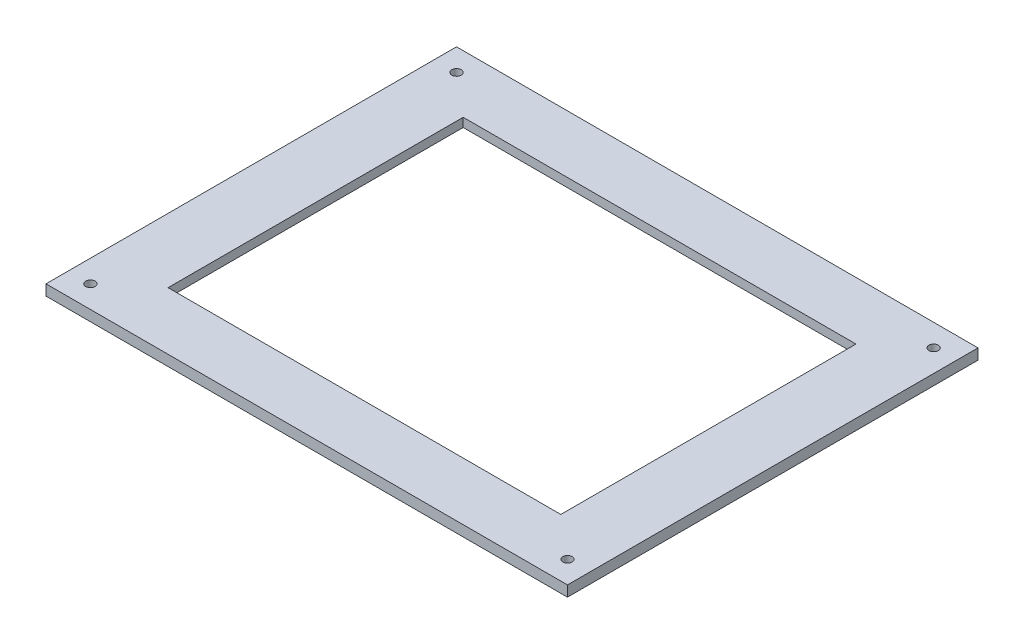
ISO-10303-21;
HEADER;
FILE_DESCRIPTION(('STEP AP214'),'2;1');
FILE_NAME('part.step','',(''),(''),'','','');
FILE_SCHEMA(('AUTOMOTIVE_DESIGN { 1 0 10303 214 1 1 1 1 }'));
ENDSEC;
DATA;
#1=APPLICATION_CONTEXT('core data for automotive mechanical design processes');
#2=APPLICATION_PROTOCOL_DEFINITION('international standard','automotive_design',2000,#1);
#3=PRODUCT_CONTEXT('',#1,'mechanical');
#4=PRODUCT('Part','Part','',(#3));
#5=PRODUCT_RELATED_PRODUCT_CATEGORY('part','',(#4));
#6=PRODUCT_DEFINITION_FORMATION('','',#4);
#7=PRODUCT_DEFINITION_CONTEXT('part definition',#1,'design');
#8=PRODUCT_DEFINITION('design','',#6,#7);
#9=PRODUCT_DEFINITION_SHAPE('','',#8);
#10=(LENGTH_UNIT() NAMED_UNIT(*) SI_UNIT(.MILLI.,.METRE.));
#11=(NAMED_UNIT(*) PLANE_ANGLE_UNIT() SI_UNIT($,.RADIAN.));
#12=(NAMED_UNIT(*) SI_UNIT($,.STERADIAN.) SOLID_ANGLE_UNIT());
#13=UNCERTAINTY_MEASURE_WITH_UNIT(LENGTH_MEASURE(1.E-05),#10,'distance_accuracy_value','');
#14=(GEOMETRIC_REPRESENTATION_CONTEXT(3) GLOBAL_UNCERTAINTY_ASSIGNED_CONTEXT((#13)) GLOBAL_UNIT_ASSIGNED_CONTEXT((#10,
#11,#12)) REPRESENTATION_CONTEXT('',''));
#15=CARTESIAN_POINT('',(0.,0.,0.));
#16=DIRECTION('',(0.,0.,1.));
#17=DIRECTION('',(1.,0.,0.));
#18=AXIS2_PLACEMENT_3D('',#15,#16,#17);
#19=CARTESIAN_POINT('',(0.,-0.8,0.));
#20=DIRECTION('',(0.,-1.,0.));
#21=DIRECTION('',(0.,0.,-1.));
#22=AXIS2_PLACEMENT_3D('',#19,#20,#21);
#23=PLANE('',#22);
#24=DIRECTION('',(-1.,0.,0.));
#25=VECTOR('',#24,1.);
#26=CARTESIAN_POINT('',(0.,-0.8,11.0000000000002));
#27=LINE('',#26,#25);
#28=CARTESIAN_POINT('',(-94.,-0.8,11.));
#29=VERTEX_POINT('',#28);
#30=CARTESIAN_POINT('',(-106.,-0.8,11.));
#31=VERTEX_POINT('',#30);
#32=EDGE_CURVE('E218',#29,#31,#27,.T.);
#33=ORIENTED_EDGE('',*,*,#32,.F.);
#34=DIRECTION('',(0.,0.,-1.));
#35=VECTOR('',#34,1.);
#36=CARTESIAN_POINT('',(-94.,-0.8,-71.));
#37=LINE('',#36,#35);
#38=CARTESIAN_POINT('',(-94.,-0.8,71.));
#39=VERTEX_POINT('',#38);
#40=EDGE_CURVE('E295',#39,#29,#37,.T.);
#41=ORIENTED_EDGE('',*,*,#40,.F.);
#42=DIRECTION('',(-1.,0.,0.));
#43=VECTOR('',#42,1.);
#44=CARTESIAN_POINT('',(94.,-0.8,71.));
#45=LINE('',#44,#43);
#46=CARTESIAN_POINT('',(94.,-0.8,71.));
#47=VERTEX_POINT('',#46);
#48=EDGE_CURVE('E308',#47,#39,#45,.T.);
#49=ORIENTED_EDGE('',*,*,#48,.F.);
#50=DIRECTION('',(0.,0.,1.));
#51=VECTOR('',#50,1.);
#52=CARTESIAN_POINT('',(94.,-0.8,-71.));
#53=LINE('',#52,#51);
#54=CARTESIAN_POINT('',(94.,-0.8,11.));
#55=VERTEX_POINT('',#54);
#56=EDGE_CURVE('E303',#55,#47,#53,.T.);
#57=ORIENTED_EDGE('',*,*,#56,.F.);
#58=DIRECTION('',(1.,0.,0.));
#59=VECTOR('',#58,1.);
#60=CARTESIAN_POINT('',(0.,-0.8,11.));
#61=LINE('',#60,#59);
#62=CARTESIAN_POINT('',(106.,-0.8,11.));
#63=VERTEX_POINT('',#62);
#64=EDGE_CURVE('E248',#55,#63,#61,.T.);
#65=ORIENTED_EDGE('',*,*,#64,.T.);
#66=DIRECTION('',(0.,0.,-1.));
#67=VECTOR('',#66,1.);
#68=CARTESIAN_POINT('',(106.,-0.8,0.));
#69=LINE('',#68,#67);
#70=CARTESIAN_POINT('',(106.,-0.8,-11.));
#71=VERTEX_POINT('',#70);
#72=EDGE_CURVE('E261',#63,#71,#69,.T.);
#73=ORIENTED_EDGE('',*,*,#72,.T.);
#74=DIRECTION('',(-1.,0.,0.));
#75=VECTOR('',#74,1.);
#76=CARTESIAN_POINT('',(0.,-0.8,-11.));
#77=LINE('',#76,#75);
#78=CARTESIAN_POINT('',(94.,-0.8,-11.));
#79=VERTEX_POINT('',#78);
#80=EDGE_CURVE('E257',#71,#79,#77,.T.);
#81=ORIENTED_EDGE('',*,*,#80,.T.);
#82=CARTESIAN_POINT('',(94.,-0.8,-71.));
#83=VERTEX_POINT('',#82);
#84=EDGE_CURVE('E304',#83,#79,#53,.T.);
#85=ORIENTED_EDGE('',*,*,#84,.F.);
#86=DIRECTION('',(1.,0.,0.));
#87=VECTOR('',#86,1.);
#88=CARTESIAN_POINT('',(94.,-0.8,-71.));
#89=LINE('',#88,#87);
#90=CARTESIAN_POINT('',(-94.,-0.8,-71.));
#91=VERTEX_POINT('',#90);
#92=EDGE_CURVE('E299',#91,#83,#89,.T.);
#93=ORIENTED_EDGE('',*,*,#92,.F.);
#94=CARTESIAN_POINT('',(-94.,-0.8,-11.));
#95=VERTEX_POINT('',#94);
#96=EDGE_CURVE('E300',#95,#91,#37,.T.);
#97=ORIENTED_EDGE('',*,*,#96,.F.);
#98=DIRECTION('',(1.,0.,0.));
#99=VECTOR('',#98,1.);
#100=CARTESIAN_POINT('',(0.,-0.8,-11.));
#101=LINE('',#100,#99);
#102=CARTESIAN_POINT('',(-106.,-0.8,-11.));
#103=VERTEX_POINT('',#102);
#104=EDGE_CURVE('E60',#103,#95,#101,.T.);
#105=ORIENTED_EDGE('',*,*,#104,.F.);
#106=DIRECTION('',(0.,0.,-1.));
#107=VECTOR('',#106,1.);
#108=CARTESIAN_POINT('',(-106.,-0.8,0.));
#109=LINE('',#108,#107);
#110=EDGE_CURVE('E200',#31,#103,#109,.T.);
#111=ORIENTED_EDGE('',*,*,#110,.F.);
#112=EDGE_LOOP('',(#33,#41,#49,#57,#65,#73,#81,#85,#93,#97,#105,#111));
#113=FACE_BOUND('',#112,.T.);
#114=CARTESIAN_POINT('',(107.5,-0.8,-82.5));
#115=DIRECTION('',(0.,-1.,0.));
#116=DIRECTION('',(0.,0.,-1.));
#117=AXIS2_PLACEMENT_3D('',#114,#115,#116);
#118=CIRCLE('',#117,2.125);
#119=CARTESIAN_POINT('',(107.5,-0.8,-84.625));
#120=VERTEX_POINT('',#119);
#121=EDGE_CURVE('E437',#120,#120,#118,.F.);
#122=ORIENTED_EDGE('',*,*,#121,.T.);
#123=EDGE_LOOP('',(#122));
#124=FACE_BOUND('',#123,.T.);
#125=CARTESIAN_POINT('',(107.5,-0.8,82.5));
#126=DIRECTION('',(0.,-1.,0.));
#127=DIRECTION('',(0.,0.,-1.));
#128=AXIS2_PLACEMENT_3D('',#125,#126,#127);
#129=CIRCLE('',#128,2.125);
#130=CARTESIAN_POINT('',(107.5,-0.8,80.375));
#131=VERTEX_POINT('',#130);
#132=EDGE_CURVE('E433',#131,#131,#129,.T.);
#133=ORIENTED_EDGE('',*,*,#132,.F.);
#134=EDGE_LOOP('',(#133));
#135=FACE_BOUND('',#134,.T.);
#136=CARTESIAN_POINT('',(-107.5,-0.8,-82.5));
#137=DIRECTION('',(0.,-1.,0.));
#138=DIRECTION('',(0.,0.,-1.));
#139=AXIS2_PLACEMENT_3D('',#136,#137,#138);
#140=CIRCLE('',#139,2.125);
#141=CARTESIAN_POINT('',(-107.5,-0.8,-84.625));
#142=VERTEX_POINT('',#141);
#143=EDGE_CURVE('E294',#142,#142,#140,.T.);
#144=ORIENTED_EDGE('',*,*,#143,.F.);
#145=EDGE_LOOP('',(#144));
#146=FACE_BOUND('',#145,.T.);
#147=DIRECTION('',(-1.,0.,0.));
#148=VECTOR('',#147,1.);
#149=CARTESIAN_POINT('',(117.5,-0.8,92.5));
#150=LINE('',#149,#148);
#151=CARTESIAN_POINT('',(117.5,-0.8,92.5));
#152=VERTEX_POINT('',#151);
#153=CARTESIAN_POINT('',(-117.5,-0.8,92.5));
#154=VERTEX_POINT('',#153);
#155=EDGE_CURVE('E345',#152,#154,#150,.T.);
#156=ORIENTED_EDGE('',*,*,#155,.T.);
#157=DIRECTION('',(0.,0.,-1.));
#158=VECTOR('',#157,1.);
#159=CARTESIAN_POINT('',(-117.5,-0.8,92.5));
#160=LINE('',#159,#158);
#161=CARTESIAN_POINT('',(-117.5,-0.8,-92.5));
#162=VERTEX_POINT('',#161);
#163=EDGE_CURVE('E349',#154,#162,#160,.T.);
#164=ORIENTED_EDGE('',*,*,#163,.T.);
#165=DIRECTION('',(1.,0.,0.));
#166=VECTOR('',#165,1.);
#167=CARTESIAN_POINT('',(-117.5,-0.8,-92.5));
#168=LINE('',#167,#166);
#169=CARTESIAN_POINT('',(117.5,-0.8,-92.5));
#170=VERTEX_POINT('',#169);
#171=EDGE_CURVE('E353',#162,#170,#168,.T.);
#172=ORIENTED_EDGE('',*,*,#171,.T.);
#173=DIRECTION('',(0.,0.,1.));
#174=VECTOR('',#173,1.);
#175=CARTESIAN_POINT('',(117.5,-0.8,-92.5));
#176=LINE('',#175,#174);
#177=EDGE_CURVE('E357',#170,#152,#176,.T.);
#178=ORIENTED_EDGE('',*,*,#177,.T.);
#179=EDGE_LOOP('',(#156,#164,#172,#178));
#180=FACE_BOUND('',#179,.T.);
#181=CARTESIAN_POINT('',(-107.5,-0.8,82.5));
#182=DIRECTION('',(0.,-1.,0.));
#183=DIRECTION('',(0.,0.,-1.));
#184=AXIS2_PLACEMENT_3D('',#181,#182,#183);
#185=CIRCLE('',#184,2.125);
#186=CARTESIAN_POINT('',(-107.5,-0.8,80.375));
#187=VERTEX_POINT('',#186);
#188=EDGE_CURVE('E441',#187,#187,#185,.F.);
#189=ORIENTED_EDGE('',*,*,#188,.T.);
#190=EDGE_LOOP('',(#189));
#191=FACE_BOUND('',#190,.T.);
#192=ADVANCED_FACE('F44',(#113,#124,#135,#146,#180,#191),#23,.T.);
#193=CARTESIAN_POINT('',(-94.,-0.8,-71.));
#194=DIRECTION('',(1.,0.,0.));
#195=DIRECTION('',(0.,0.,-1.));
#196=AXIS2_PLACEMENT_3D('',#193,#194,#195);
#197=PLANE('',#196);
#198=DIRECTION('',(0.,-1.,0.));
#199=VECTOR('',#198,1.);
#200=CARTESIAN_POINT('',(-94.,-0.8,11.));
#201=LINE('',#200,#199);
#202=CARTESIAN_POINT('',(-94.,0.,11.));
#203=VERTEX_POINT('',#202);
#204=EDGE_CURVE('E11',#203,#29,#201,.T.);
#205=ORIENTED_EDGE('',*,*,#204,.F.);
#206=DIRECTION('',(0.,0.,-1.));
#207=VECTOR('',#206,1.);
#208=CARTESIAN_POINT('',(-94.,0.,-71.));
#209=LINE('',#208,#207);
#210=CARTESIAN_POINT('',(-94.,0.,71.));
#211=VERTEX_POINT('',#210);
#212=EDGE_CURVE('E312',#211,#203,#209,.T.);
#213=ORIENTED_EDGE('',*,*,#212,.F.);
#214=DIRECTION('',(0.,1.,0.));
#215=VECTOR('',#214,1.);
#216=CARTESIAN_POINT('',(-94.,-0.8,71.));
#217=LINE('',#216,#215);
#218=EDGE_CURVE('E311',#39,#211,#217,.T.);
#219=ORIENTED_EDGE('',*,*,#218,.F.);
#220=ORIENTED_EDGE('',*,*,#40,.T.);
#221=EDGE_LOOP('',(#205,#213,#219,#220));
#222=FACE_BOUND('',#221,.T.);
#223=ADVANCED_FACE('F488',(#222),#197,.T.);
#224=CARTESIAN_POINT('',(94.,-0.8,-71.));
#225=DIRECTION('',(-1.,0.,0.));
#226=DIRECTION('',(0.,0.,1.));
#227=AXIS2_PLACEMENT_3D('',#224,#225,#226);
#228=PLANE('',#227);
#229=DIRECTION('',(0.,0.,1.));
#230=VECTOR('',#229,1.);
#231=CARTESIAN_POINT('',(94.,0.,-71.));
#232=LINE('',#231,#230);
#233=CARTESIAN_POINT('',(94.,0.,11.));
#234=VERTEX_POINT('',#233);
#235=CARTESIAN_POINT('',(94.,0.,71.));
#236=VERTEX_POINT('',#235);
#237=EDGE_CURVE('E322',#234,#236,#232,.T.);
#238=ORIENTED_EDGE('',*,*,#237,.F.);
#239=DIRECTION('',(0.,-1.,0.));
#240=VECTOR('',#239,1.);
#241=CARTESIAN_POINT('',(94.,-0.8,11.));
#242=LINE('',#241,#240);
#243=EDGE_CURVE('E448',#234,#55,#242,.T.);
#244=ORIENTED_EDGE('',*,*,#243,.T.);
#245=ORIENTED_EDGE('',*,*,#56,.T.);
#246=DIRECTION('',(0.,1.,0.));
#247=VECTOR('',#246,1.);
#248=CARTESIAN_POINT('',(94.,-0.8,71.));
#249=LINE('',#248,#247);
#250=EDGE_CURVE('E334',#47,#236,#249,.T.);
#251=ORIENTED_EDGE('',*,*,#250,.T.);
#252=EDGE_LOOP('',(#238,#244,#245,#251));
#253=FACE_BOUND('',#252,.T.);
#254=ADVANCED_FACE('F476',(#253),#228,.T.);
#255=ORIENTED_EDGE('',*,*,#84,.T.);
#256=DIRECTION('',(0.,1.,0.));
#257=VECTOR('',#256,1.);
#258=CARTESIAN_POINT('',(94.,-0.8,-11.));
#259=LINE('',#258,#257);
#260=CARTESIAN_POINT('',(94.,0.,-11.));
#261=VERTEX_POINT('',#260);
#262=EDGE_CURVE('E429',#79,#261,#259,.T.);
#263=ORIENTED_EDGE('',*,*,#262,.T.);
#264=CARTESIAN_POINT('',(94.,0.,-71.));
#265=VERTEX_POINT('',#264);
#266=EDGE_CURVE('E323',#265,#261,#232,.T.);
#267=ORIENTED_EDGE('',*,*,#266,.F.);
#268=DIRECTION('',(0.,1.,0.));
#269=VECTOR('',#268,1.);
#270=CARTESIAN_POINT('',(94.,-0.8,-71.));
#271=LINE('',#270,#269);
#272=EDGE_CURVE('E338',#83,#265,#271,.T.);
#273=ORIENTED_EDGE('',*,*,#272,.F.);
#274=EDGE_LOOP('',(#255,#263,#267,#273));
#275=FACE_BOUND('',#274,.T.);
#276=ADVANCED_FACE('F494',(#275),#228,.T.);
#277=CARTESIAN_POINT('',(0.,4.,0.));
#278=DIRECTION('',(0.,1.,0.));
#279=DIRECTION('',(0.,0.,1.));
#280=AXIS2_PLACEMENT_3D('',#277,#278,#279);
#281=PLANE('',#280);
#282=CARTESIAN_POINT('',(107.5,4.,-82.5));
#283=DIRECTION('',(0.,1.,0.));
#284=DIRECTION('',(0.,0.,1.));
#285=AXIS2_PLACEMENT_3D('',#282,#283,#284);
#286=CIRCLE('',#285,2.125);
#287=CARTESIAN_POINT('',(107.5,4.,-80.375));
#288=VERTEX_POINT('',#287);
#289=EDGE_CURVE('E282',#288,#288,#286,.F.);
#290=ORIENTED_EDGE('',*,*,#289,.T.);
#291=EDGE_LOOP('',(#290));
#292=FACE_BOUND('',#291,.T.);
#293=CARTESIAN_POINT('',(107.5,4.,82.5));
#294=DIRECTION('',(0.,1.,0.));
#295=DIRECTION('',(0.,0.,1.));
#296=AXIS2_PLACEMENT_3D('',#293,#294,#295);
#297=CIRCLE('',#296,2.125);
#298=CARTESIAN_POINT('',(107.5,4.,84.625));
#299=VERTEX_POINT('',#298);
#300=EDGE_CURVE('E236',#299,#299,#297,.T.);
#301=ORIENTED_EDGE('',*,*,#300,.F.);
#302=EDGE_LOOP('',(#301));
#303=FACE_BOUND('',#302,.T.);
#304=CARTESIAN_POINT('',(-107.5,4.,-82.5));
#305=DIRECTION('',(0.,1.,0.));
#306=DIRECTION('',(0.,0.,1.));
#307=AXIS2_PLACEMENT_3D('',#304,#305,#306);
#308=CIRCLE('',#307,2.125);
#309=CARTESIAN_POINT('',(-107.5,4.,-80.375));
#310=VERTEX_POINT('',#309);
#311=EDGE_CURVE('E287',#310,#310,#308,.T.);
#312=ORIENTED_EDGE('',*,*,#311,.F.);
#313=EDGE_LOOP('',(#312));
#314=FACE_BOUND('',#313,.T.);
#315=DIRECTION('',(0.,0.,1.));
#316=VECTOR('',#315,1.);
#317=CARTESIAN_POINT('',(-117.5,4.,92.5));
#318=LINE('',#317,#316);
#319=CARTESIAN_POINT('',(-117.5,4.,-92.5));
#320=VERTEX_POINT('',#319);
#321=CARTESIAN_POINT('',(-117.5,4.,92.5));
#322=VERTEX_POINT('',#321);
#323=EDGE_CURVE('E404',#320,#322,#318,.T.);
#324=ORIENTED_EDGE('',*,*,#323,.T.);
#325=DIRECTION('',(1.,0.,0.));
#326=VECTOR('',#325,1.);
#327=CARTESIAN_POINT('',(117.5,4.,92.5));
#328=LINE('',#327,#326);
#329=CARTESIAN_POINT('',(117.5,4.,92.5));
#330=VERTEX_POINT('',#329);
#331=EDGE_CURVE('E408',#322,#330,#328,.T.);
#332=ORIENTED_EDGE('',*,*,#331,.T.);
#333=DIRECTION('',(0.,0.,-1.));
#334=VECTOR('',#333,1.);
#335=CARTESIAN_POINT('',(117.5,4.,92.5));
#336=LINE('',#335,#334);
#337=CARTESIAN_POINT('',(117.5,4.,-92.5));
#338=VERTEX_POINT('',#337);
#339=EDGE_CURVE('E411',#330,#338,#336,.T.);
#340=ORIENTED_EDGE('',*,*,#339,.T.);
#341=DIRECTION('',(-1.,0.,0.));
#342=VECTOR('',#341,1.);
#343=CARTESIAN_POINT('',(117.5,4.,-92.5));
#344=LINE('',#343,#342);
#345=EDGE_CURVE('E414',#338,#320,#344,.T.);
#346=ORIENTED_EDGE('',*,*,#345,.T.);
#347=EDGE_LOOP('',(#324,#332,#340,#346));
#348=FACE_BOUND('',#347,.T.);
#349=DIRECTION('',(1.,0.,0.));
#350=VECTOR('',#349,1.);
#351=CARTESIAN_POINT('',(88.5,4.,66.5));
#352=LINE('',#351,#350);
#353=CARTESIAN_POINT('',(-88.5,4.,66.5));
#354=VERTEX_POINT('',#353);
#355=CARTESIAN_POINT('',(88.5,4.,66.5));
#356=VERTEX_POINT('',#355);
#357=EDGE_CURVE('E365',#354,#356,#352,.T.);
#358=ORIENTED_EDGE('',*,*,#357,.F.);
#359=DIRECTION('',(0.,0.,1.));
#360=VECTOR('',#359,1.);
#361=CARTESIAN_POINT('',(-88.5,4.,66.5));
#362=LINE('',#361,#360);
#363=CARTESIAN_POINT('',(-88.5,4.,-66.5));
#364=VERTEX_POINT('',#363);
#365=EDGE_CURVE('E362',#364,#354,#362,.T.);
#366=ORIENTED_EDGE('',*,*,#365,.F.);
#367=DIRECTION('',(-1.,0.,0.));
#368=VECTOR('',#367,1.);
#369=CARTESIAN_POINT('',(88.5,4.,-66.5));
#370=LINE('',#369,#368);
#371=CARTESIAN_POINT('',(88.5,4.,-66.5));
#372=VERTEX_POINT('',#371);
#373=EDGE_CURVE('E373',#372,#364,#370,.T.);
#374=ORIENTED_EDGE('',*,*,#373,.F.);
#375=DIRECTION('',(0.,0.,-1.));
#376=VECTOR('',#375,1.);
#377=CARTESIAN_POINT('',(88.5,4.,66.5));
#378=LINE('',#377,#376);
#379=EDGE_CURVE('E369',#356,#372,#378,.T.);
#380=ORIENTED_EDGE('',*,*,#379,.F.);
#381=EDGE_LOOP('',(#358,#366,#374,#380));
#382=FACE_BOUND('',#381,.T.);
#383=CARTESIAN_POINT('',(-107.5,4.,82.5));
#384=DIRECTION('',(0.,1.,0.));
#385=DIRECTION('',(0.,0.,1.));
#386=AXIS2_PLACEMENT_3D('',#383,#384,#385);
#387=CIRCLE('',#386,2.125);
#388=CARTESIAN_POINT('',(-107.5,4.,84.625));
#389=VERTEX_POINT('',#388);
#390=EDGE_CURVE('E283',#389,#389,#387,.F.);
#391=ORIENTED_EDGE('',*,*,#390,.T.);
#392=EDGE_LOOP('',(#391));
#393=FACE_BOUND('',#392,.T.);
#394=ADVANCED_FACE('F547',(#292,#303,#314,#348,#382,#393),#281,.T.);
#395=CARTESIAN_POINT('',(0.,0.,0.));
#396=DIRECTION('',(0.,1.,0.));
#397=DIRECTION('',(0.,0.,1.));
#398=AXIS2_PLACEMENT_3D('',#395,#396,#397);
#399=PLANE('',#398);
#400=DIRECTION('',(-1.,0.,0.));
#401=VECTOR('',#400,1.);
#402=CARTESIAN_POINT('',(94.,0.,71.));
#403=LINE('',#402,#401);
#404=EDGE_CURVE('E327',#236,#211,#403,.T.);
#405=ORIENTED_EDGE('',*,*,#404,.T.);
#406=ORIENTED_EDGE('',*,*,#212,.T.);
#407=CARTESIAN_POINT('',(-94.,0.,-11.));
#408=VERTEX_POINT('',#407);
#409=EDGE_CURVE('E317',#203,#408,#209,.T.);
#410=ORIENTED_EDGE('',*,*,#409,.T.);
#411=CARTESIAN_POINT('',(-94.,0.,-71.));
#412=VERTEX_POINT('',#411);
#413=EDGE_CURVE('E318',#408,#412,#209,.T.);
#414=ORIENTED_EDGE('',*,*,#413,.T.);
#415=DIRECTION('',(1.,0.,0.));
#416=VECTOR('',#415,1.);
#417=CARTESIAN_POINT('',(94.,0.,-71.));
#418=LINE('',#417,#416);
#419=EDGE_CURVE('E316',#412,#265,#418,.T.);
#420=ORIENTED_EDGE('',*,*,#419,.T.);
#421=ORIENTED_EDGE('',*,*,#266,.T.);
#422=EDGE_CURVE('E328',#261,#234,#232,.T.);
#423=ORIENTED_EDGE('',*,*,#422,.T.);
#424=ORIENTED_EDGE('',*,*,#237,.T.);
#425=EDGE_LOOP('',(#405,#406,#410,#414,#420,#421,#423,#424));
#426=FACE_BOUND('',#425,.T.);
#427=DIRECTION('',(0.,0.,1.));
#428=VECTOR('',#427,1.);
#429=CARTESIAN_POINT('',(-88.5,0.,66.5));
#430=LINE('',#429,#428);
#431=CARTESIAN_POINT('',(-88.5,0.,-66.5));
#432=VERTEX_POINT('',#431);
#433=CARTESIAN_POINT('',(-88.5,0.,66.5));
#434=VERTEX_POINT('',#433);
#435=EDGE_CURVE('E361',#432,#434,#430,.T.);
#436=ORIENTED_EDGE('',*,*,#435,.T.);
#437=DIRECTION('',(1.,0.,0.));
#438=VECTOR('',#437,1.);
#439=CARTESIAN_POINT('',(88.5,0.,66.5));
#440=LINE('',#439,#438);
#441=CARTESIAN_POINT('',(88.5,0.,66.5));
#442=VERTEX_POINT('',#441);
#443=EDGE_CURVE('E380',#434,#442,#440,.T.);
#444=ORIENTED_EDGE('',*,*,#443,.T.);
#445=DIRECTION('',(0.,0.,-1.));
#446=VECTOR('',#445,1.);
#447=CARTESIAN_POINT('',(88.5,0.,66.5));
#448=LINE('',#447,#446);
#449=CARTESIAN_POINT('',(88.5,0.,-66.5));
#450=VERTEX_POINT('',#449);
#451=EDGE_CURVE('E384',#442,#450,#448,.T.);
#452=ORIENTED_EDGE('',*,*,#451,.T.);
#453=DIRECTION('',(-1.,0.,0.));
#454=VECTOR('',#453,1.);
#455=CARTESIAN_POINT('',(88.5,0.,-66.5));
#456=LINE('',#455,#454);
#457=EDGE_CURVE('E366',#450,#432,#456,.T.);
#458=ORIENTED_EDGE('',*,*,#457,.T.);
#459=EDGE_LOOP('',(#436,#444,#452,#458));
#460=FACE_BOUND('',#459,.T.);
#461=ADVANCED_FACE('F463',(#426,#460),#399,.F.);
#462=CARTESIAN_POINT('',(-117.5,4.,92.5));
#463=DIRECTION('',(1.,0.,0.));
#464=DIRECTION('',(0.,0.,-1.));
#465=AXIS2_PLACEMENT_3D('',#462,#463,#464);
#466=PLANE('',#465);
#467=DIRECTION('',(0.,-1.,0.));
#468=VECTOR('',#467,1.);
#469=CARTESIAN_POINT('',(-117.5,4.,-92.5));
#470=LINE('',#469,#468);
#471=EDGE_CURVE('E417',#320,#162,#470,.T.);
#472=ORIENTED_EDGE('',*,*,#471,.T.);
#473=ORIENTED_EDGE('',*,*,#163,.F.);
#474=DIRECTION('',(0.,-1.,0.));
#475=VECTOR('',#474,1.);
#476=CARTESIAN_POINT('',(-117.5,4.,92.5));
#477=LINE('',#476,#475);
#478=EDGE_CURVE('E426',#322,#154,#477,.T.);
#479=ORIENTED_EDGE('',*,*,#478,.F.);
#480=ORIENTED_EDGE('',*,*,#323,.F.);
#481=EDGE_LOOP('',(#472,#473,#479,#480));
#482=FACE_BOUND('',#481,.T.);
#483=ADVANCED_FACE('F46',(#482),#466,.F.);
#484=CARTESIAN_POINT('',(117.5,4.,92.5));
#485=DIRECTION('',(0.,0.,-1.));
#486=DIRECTION('',(-1.,0.,0.));
#487=AXIS2_PLACEMENT_3D('',#484,#485,#486);
#488=PLANE('',#487);
#489=ORIENTED_EDGE('',*,*,#478,.T.);
#490=ORIENTED_EDGE('',*,*,#155,.F.);
#491=DIRECTION('',(0.,-1.,0.));
#492=VECTOR('',#491,1.);
#493=CARTESIAN_POINT('',(117.5,4.,92.5));
#494=LINE('',#493,#492);
#495=EDGE_CURVE('E423',#330,#152,#494,.T.);
#496=ORIENTED_EDGE('',*,*,#495,.F.);
#497=ORIENTED_EDGE('',*,*,#331,.F.);
#498=EDGE_LOOP('',(#489,#490,#496,#497));
#499=FACE_BOUND('',#498,.T.);
#500=ADVANCED_FACE('F558',(#499),#488,.F.);
#501=CARTESIAN_POINT('',(117.5,4.,92.5));
#502=DIRECTION('',(-1.,0.,0.));
#503=DIRECTION('',(0.,0.,1.));
#504=AXIS2_PLACEMENT_3D('',#501,#502,#503);
#505=PLANE('',#504);
#506=ORIENTED_EDGE('',*,*,#495,.T.);
#507=ORIENTED_EDGE('',*,*,#177,.F.);
#508=DIRECTION('',(0.,-1.,0.));
#509=VECTOR('',#508,1.);
#510=CARTESIAN_POINT('',(117.5,4.,-92.5));
#511=LINE('',#510,#509);
#512=EDGE_CURVE('E420',#338,#170,#511,.T.);
#513=ORIENTED_EDGE('',*,*,#512,.F.);
#514=ORIENTED_EDGE('',*,*,#339,.F.);
#515=EDGE_LOOP('',(#506,#507,#513,#514));
#516=FACE_BOUND('',#515,.T.);
#517=ADVANCED_FACE('F555',(#516),#505,.F.);
#518=CARTESIAN_POINT('',(117.5,4.,-92.5));
#519=DIRECTION('',(0.,0.,1.));
#520=DIRECTION('',(1.,0.,0.));
#521=AXIS2_PLACEMENT_3D('',#518,#519,#520);
#522=PLANE('',#521);
#523=ORIENTED_EDGE('',*,*,#512,.T.);
#524=ORIENTED_EDGE('',*,*,#171,.F.);
#525=ORIENTED_EDGE('',*,*,#471,.F.);
#526=ORIENTED_EDGE('',*,*,#345,.F.);
#527=EDGE_LOOP('',(#523,#524,#525,#526));
#528=FACE_BOUND('',#527,.T.);
#529=ADVANCED_FACE('F545',(#528),#522,.F.);
#530=CARTESIAN_POINT('',(-88.5,4.,66.5));
#531=DIRECTION('',(1.,0.,0.));
#532=DIRECTION('',(0.,0.,-1.));
#533=AXIS2_PLACEMENT_3D('',#530,#531,#532);
#534=PLANE('',#533);
#535=ORIENTED_EDGE('',*,*,#435,.F.);
#536=DIRECTION('',(0.,-1.,0.));
#537=VECTOR('',#536,1.);
#538=CARTESIAN_POINT('',(-88.5,4.,-66.5));
#539=LINE('',#538,#537);
#540=EDGE_CURVE('E376',#364,#432,#539,.T.);
#541=ORIENTED_EDGE('',*,*,#540,.F.);
#542=ORIENTED_EDGE('',*,*,#365,.T.);
#543=DIRECTION('',(0.,-1.,0.));
#544=VECTOR('',#543,1.);
#545=CARTESIAN_POINT('',(-88.5,4.,66.5));
#546=LINE('',#545,#544);
#547=EDGE_CURVE('E400',#354,#434,#546,.T.);
#548=ORIENTED_EDGE('',*,*,#547,.T.);
#549=EDGE_LOOP('',(#535,#541,#542,#548));
#550=FACE_BOUND('',#549,.T.);
#551=ADVANCED_FACE('F541',(#550),#534,.T.);
#552=CARTESIAN_POINT('',(88.5,4.,66.5));
#553=DIRECTION('',(0.,0.,-1.));
#554=DIRECTION('',(-1.,0.,0.));
#555=AXIS2_PLACEMENT_3D('',#552,#553,#554);
#556=PLANE('',#555);
#557=ORIENTED_EDGE('',*,*,#443,.F.);
#558=ORIENTED_EDGE('',*,*,#547,.F.);
#559=ORIENTED_EDGE('',*,*,#357,.T.);
#560=DIRECTION('',(0.,-1.,0.));
#561=VECTOR('',#560,1.);
#562=CARTESIAN_POINT('',(88.5,4.,66.5));
#563=LINE('',#562,#561);
#564=EDGE_CURVE('E397',#356,#442,#563,.T.);
#565=ORIENTED_EDGE('',*,*,#564,.T.);
#566=EDGE_LOOP('',(#557,#558,#559,#565));
#567=FACE_BOUND('',#566,.T.);
#568=ADVANCED_FACE('F537',(#567),#556,.T.);
#569=CARTESIAN_POINT('',(88.5,4.,66.5));
#570=DIRECTION('',(-1.,0.,0.));
#571=DIRECTION('',(0.,0.,1.));
#572=AXIS2_PLACEMENT_3D('',#569,#570,#571);
#573=PLANE('',#572);
#574=ORIENTED_EDGE('',*,*,#451,.F.);
#575=ORIENTED_EDGE('',*,*,#564,.F.);
#576=ORIENTED_EDGE('',*,*,#379,.T.);
#577=DIRECTION('',(0.,-1.,0.));
#578=VECTOR('',#577,1.);
#579=CARTESIAN_POINT('',(88.5,4.,-66.5));
#580=LINE('',#579,#578);
#581=EDGE_CURVE('E394',#372,#450,#580,.T.);
#582=ORIENTED_EDGE('',*,*,#581,.T.);
#583=EDGE_LOOP('',(#574,#575,#576,#582));
#584=FACE_BOUND('',#583,.T.);
#585=ADVANCED_FACE('F533',(#584),#573,.T.);
#586=CARTESIAN_POINT('',(88.5,4.,-66.5));
#587=DIRECTION('',(0.,0.,1.));
#588=DIRECTION('',(1.,0.,0.));
#589=AXIS2_PLACEMENT_3D('',#586,#587,#588);
#590=PLANE('',#589);
#591=ORIENTED_EDGE('',*,*,#457,.F.);
#592=ORIENTED_EDGE('',*,*,#581,.F.);
#593=ORIENTED_EDGE('',*,*,#373,.T.);
#594=ORIENTED_EDGE('',*,*,#540,.T.);
#595=EDGE_LOOP('',(#591,#592,#593,#594));
#596=FACE_BOUND('',#595,.T.);
#597=ADVANCED_FACE('F530',(#596),#590,.T.);
#598=DIRECTION('',(0.,1.,0.));
#599=VECTOR('',#598,1.);
#600=CARTESIAN_POINT('',(-94.,-0.8,-11.));
#601=LINE('',#600,#599);
#602=EDGE_CURVE('E53',#95,#408,#601,.T.);
#603=ORIENTED_EDGE('',*,*,#602,.F.);
#604=ORIENTED_EDGE('',*,*,#96,.T.);
#605=DIRECTION('',(0.,1.,0.));
#606=VECTOR('',#605,1.);
#607=CARTESIAN_POINT('',(-94.,-0.8,-71.));
#608=LINE('',#607,#606);
#609=EDGE_CURVE('E341',#91,#412,#608,.T.);
#610=ORIENTED_EDGE('',*,*,#609,.T.);
#611=ORIENTED_EDGE('',*,*,#413,.F.);
#612=EDGE_LOOP('',(#603,#604,#610,#611));
#613=FACE_BOUND('',#612,.T.);
#614=ADVANCED_FACE('F458',(#613),#197,.T.);
#615=CARTESIAN_POINT('',(94.,-0.8,-71.));
#616=DIRECTION('',(0.,0.,1.));
#617=DIRECTION('',(1.,0.,0.));
#618=AXIS2_PLACEMENT_3D('',#615,#616,#617);
#619=PLANE('',#618);
#620=ORIENTED_EDGE('',*,*,#419,.F.);
#621=ORIENTED_EDGE('',*,*,#609,.F.);
#622=ORIENTED_EDGE('',*,*,#92,.T.);
#623=ORIENTED_EDGE('',*,*,#272,.T.);
#624=EDGE_LOOP('',(#620,#621,#622,#623));
#625=FACE_BOUND('',#624,.T.);
#626=ADVANCED_FACE('F606',(#625),#619,.T.);
#627=CARTESIAN_POINT('',(94.,-0.8,71.));
#628=DIRECTION('',(0.,0.,-1.));
#629=DIRECTION('',(-1.,0.,0.));
#630=AXIS2_PLACEMENT_3D('',#627,#628,#629);
#631=PLANE('',#630);
#632=ORIENTED_EDGE('',*,*,#404,.F.);
#633=ORIENTED_EDGE('',*,*,#250,.F.);
#634=ORIENTED_EDGE('',*,*,#48,.T.);
#635=ORIENTED_EDGE('',*,*,#218,.T.);
#636=EDGE_LOOP('',(#632,#633,#634,#635));
#637=FACE_BOUND('',#636,.T.);
#638=ADVANCED_FACE('F481',(#637),#631,.T.);
#639=CARTESIAN_POINT('',(-107.5,-1.,-82.5));
#640=DIRECTION('',(0.,1.,0.));
#641=DIRECTION('',(0.,0.,1.));
#642=AXIS2_PLACEMENT_3D('',#639,#640,#641);
#643=CYLINDRICAL_SURFACE('',#642,2.125);
#644=ORIENTED_EDGE('',*,*,#143,.T.);
#645=EDGE_LOOP('',(#644));
#646=FACE_BOUND('',#645,.T.);
#647=ORIENTED_EDGE('',*,*,#311,.T.);
#648=EDGE_LOOP('',(#647));
#649=FACE_BOUND('',#648,.T.);
#650=ADVANCED_FACE('F600',(#646,#649),#643,.F.);
#651=CARTESIAN_POINT('',(107.5,-1.,82.5));
#652=DIRECTION('',(0.,1.,0.));
#653=DIRECTION('',(0.,0.,1.));
#654=AXIS2_PLACEMENT_3D('',#651,#652,#653);
#655=CYLINDRICAL_SURFACE('',#654,2.125);
#656=ORIENTED_EDGE('',*,*,#132,.T.);
#657=EDGE_LOOP('',(#656));
#658=FACE_BOUND('',#657,.T.);
#659=ORIENTED_EDGE('',*,*,#300,.T.);
#660=EDGE_LOOP('',(#659));
#661=FACE_BOUND('',#660,.T.);
#662=ADVANCED_FACE('F594',(#658,#661),#655,.F.);
#663=CARTESIAN_POINT('',(107.5,-1.,-82.5));
#664=DIRECTION('',(0.,1.,0.));
#665=DIRECTION('',(0.,0.,1.));
#666=AXIS2_PLACEMENT_3D('',#663,#664,#665);
#667=CYLINDRICAL_SURFACE('',#666,2.125);
#668=ORIENTED_EDGE('',*,*,#121,.F.);
#669=EDGE_LOOP('',(#668));
#670=FACE_BOUND('',#669,.T.);
#671=ORIENTED_EDGE('',*,*,#289,.F.);
#672=EDGE_LOOP('',(#671));
#673=FACE_BOUND('',#672,.T.);
#674=ADVANCED_FACE('F588',(#670,#673),#667,.F.);
#675=CARTESIAN_POINT('',(-107.5,-1.,82.5));
#676=DIRECTION('',(0.,1.,0.));
#677=DIRECTION('',(0.,0.,1.));
#678=AXIS2_PLACEMENT_3D('',#675,#676,#677);
#679=CYLINDRICAL_SURFACE('',#678,2.125);
#680=ORIENTED_EDGE('',*,*,#188,.F.);
#681=EDGE_LOOP('',(#680));
#682=FACE_BOUND('',#681,.T.);
#683=ORIENTED_EDGE('',*,*,#390,.F.);
#684=EDGE_LOOP('',(#683));
#685=FACE_BOUND('',#684,.T.);
#686=ADVANCED_FACE('F519',(#682,#685),#679,.F.);
#687=CARTESIAN_POINT('',(94.,0.4,0.));
#688=DIRECTION('',(-1.,0.,0.));
#689=DIRECTION('',(0.,0.,1.));
#690=AXIS2_PLACEMENT_3D('',#687,#688,#689);
#691=PLANE('',#690);
#692=DIRECTION('',(0.,-1.,0.));
#693=VECTOR('',#692,1.);
#694=CARTESIAN_POINT('',(94.,0.4,-11.));
#695=LINE('',#694,#693);
#696=CARTESIAN_POINT('',(94.,0.4,-11.));
#697=VERTEX_POINT('',#696);
#698=EDGE_CURVE('E68',#697,#261,#695,.T.);
#699=ORIENTED_EDGE('',*,*,#698,.F.);
#700=DIRECTION('',(0.,0.,-1.));
#701=VECTOR('',#700,1.);
#702=CARTESIAN_POINT('',(94.,0.4,0.));
#703=LINE('',#702,#701);
#704=CARTESIAN_POINT('',(94.,0.4,11.));
#705=VERTEX_POINT('',#704);
#706=EDGE_CURVE('E243',#705,#697,#703,.T.);
#707=ORIENTED_EDGE('',*,*,#706,.F.);
#708=DIRECTION('',(0.,-1.,0.));
#709=VECTOR('',#708,1.);
#710=CARTESIAN_POINT('',(94.,0.4,11.));
#711=LINE('',#710,#709);
#712=EDGE_CURVE('E230',#705,#234,#711,.T.);
#713=ORIENTED_EDGE('',*,*,#712,.T.);
#714=ORIENTED_EDGE('',*,*,#422,.F.);
#715=EDGE_LOOP('',(#699,#707,#713,#714));
#716=FACE_BOUND('',#715,.T.);
#717=ADVANCED_FACE('F491',(#716),#691,.F.);
#718=CARTESIAN_POINT('',(0.,0.4,11.));
#719=DIRECTION('',(0.,0.,-1.));
#720=DIRECTION('',(-1.,0.,0.));
#721=AXIS2_PLACEMENT_3D('',#718,#719,#720);
#722=PLANE('',#721);
#723=ORIENTED_EDGE('',*,*,#64,.F.);
#724=ORIENTED_EDGE('',*,*,#243,.F.);
#725=ORIENTED_EDGE('',*,*,#712,.F.);
#726=DIRECTION('',(1.,0.,0.));
#727=VECTOR('',#726,1.);
#728=CARTESIAN_POINT('',(0.,0.4,11.));
#729=LINE('',#728,#727);
#730=CARTESIAN_POINT('',(106.,0.4,11.));
#731=VERTEX_POINT('',#730);
#732=EDGE_CURVE('E254',#705,#731,#729,.T.);
#733=ORIENTED_EDGE('',*,*,#732,.T.);
#734=DIRECTION('',(0.,-1.,0.));
#735=VECTOR('',#734,1.);
#736=CARTESIAN_POINT('',(106.,0.4,11.));
#737=LINE('',#736,#735);
#738=EDGE_CURVE('E271',#731,#63,#737,.T.);
#739=ORIENTED_EDGE('',*,*,#738,.T.);
#740=EDGE_LOOP('',(#723,#724,#725,#733,#739));
#741=FACE_BOUND('',#740,.T.);
#742=ADVANCED_FACE('F511',(#741),#722,.T.);
#743=CARTESIAN_POINT('',(106.,0.4,0.));
#744=DIRECTION('',(-1.,0.,0.));
#745=DIRECTION('',(0.,0.,1.));
#746=AXIS2_PLACEMENT_3D('',#743,#744,#745);
#747=PLANE('',#746);
#748=ORIENTED_EDGE('',*,*,#72,.F.);
#749=ORIENTED_EDGE('',*,*,#738,.F.);
#750=DIRECTION('',(0.,0.,-1.));
#751=VECTOR('',#750,1.);
#752=CARTESIAN_POINT('',(106.,0.4,0.));
#753=LINE('',#752,#751);
#754=CARTESIAN_POINT('',(106.,0.4,-11.));
#755=VERTEX_POINT('',#754);
#756=EDGE_CURVE('E251',#731,#755,#753,.T.);
#757=ORIENTED_EDGE('',*,*,#756,.T.);
#758=DIRECTION('',(0.,-1.,0.));
#759=VECTOR('',#758,1.);
#760=CARTESIAN_POINT('',(106.,0.4,-11.));
#761=LINE('',#760,#759);
#762=EDGE_CURVE('E274',#755,#71,#761,.T.);
#763=ORIENTED_EDGE('',*,*,#762,.T.);
#764=EDGE_LOOP('',(#748,#749,#757,#763));
#765=FACE_BOUND('',#764,.T.);
#766=ADVANCED_FACE('F504',(#765),#747,.T.);
#767=CARTESIAN_POINT('',(0.,0.4,-11.));
#768=DIRECTION('',(0.,0.,1.));
#769=DIRECTION('',(1.,0.,0.));
#770=AXIS2_PLACEMENT_3D('',#767,#768,#769);
#771=PLANE('',#770);
#772=ORIENTED_EDGE('',*,*,#80,.F.);
#773=ORIENTED_EDGE('',*,*,#762,.F.);
#774=DIRECTION('',(-1.,0.,0.));
#775=VECTOR('',#774,1.);
#776=CARTESIAN_POINT('',(0.,0.4,-11.));
#777=LINE('',#776,#775);
#778=EDGE_CURVE('E247',#755,#697,#777,.T.);
#779=ORIENTED_EDGE('',*,*,#778,.T.);
#780=ORIENTED_EDGE('',*,*,#698,.T.);
#781=ORIENTED_EDGE('',*,*,#262,.F.);
#782=EDGE_LOOP('',(#772,#773,#779,#780,#781));
#783=FACE_BOUND('',#782,.T.);
#784=ADVANCED_FACE('F498',(#783),#771,.T.);
#785=CARTESIAN_POINT('',(0.,0.4,0.));
#786=DIRECTION('',(0.,-1.,0.));
#787=DIRECTION('',(0.,0.,-1.));
#788=AXIS2_PLACEMENT_3D('',#785,#786,#787);
#789=PLANE('',#788);
#790=ORIENTED_EDGE('',*,*,#706,.T.);
#791=ORIENTED_EDGE('',*,*,#778,.F.);
#792=ORIENTED_EDGE('',*,*,#756,.F.);
#793=ORIENTED_EDGE('',*,*,#732,.F.);
#794=EDGE_LOOP('',(#790,#791,#792,#793));
#795=FACE_BOUND('',#794,.T.);
#796=ADVANCED_FACE('F508',(#795),#789,.T.);
#797=CARTESIAN_POINT('',(-94.,0.4,0.));
#798=DIRECTION('',(1.,0.,0.));
#799=DIRECTION('',(0.,0.,-1.));
#800=AXIS2_PLACEMENT_3D('',#797,#798,#799);
#801=PLANE('',#800);
#802=DIRECTION('',(0.,-1.,0.));
#803=VECTOR('',#802,1.);
#804=CARTESIAN_POINT('',(-94.,0.4,11.));
#805=LINE('',#804,#803);
#806=CARTESIAN_POINT('',(-94.,0.4,11.));
#807=VERTEX_POINT('',#806);
#808=EDGE_CURVE('E237',#807,#203,#805,.T.);
#809=ORIENTED_EDGE('',*,*,#808,.F.);
#810=DIRECTION('',(0.,0.,1.));
#811=VECTOR('',#810,1.);
#812=CARTESIAN_POINT('',(-94.,0.4,0.));
#813=LINE('',#812,#811);
#814=CARTESIAN_POINT('',(-94.,0.4,-11.));
#815=VERTEX_POINT('',#814);
#816=EDGE_CURVE('E213',#815,#807,#813,.T.);
#817=ORIENTED_EDGE('',*,*,#816,.F.);
#818=DIRECTION('',(0.,-1.,0.));
#819=VECTOR('',#818,1.);
#820=CARTESIAN_POINT('',(-94.,0.4,-11.));
#821=LINE('',#820,#819);
#822=EDGE_CURVE('E202',#815,#408,#821,.T.);
#823=ORIENTED_EDGE('',*,*,#822,.T.);
#824=ORIENTED_EDGE('',*,*,#409,.F.);
#825=EDGE_LOOP('',(#809,#817,#823,#824));
#826=FACE_BOUND('',#825,.T.);
#827=ADVANCED_FACE('F456',(#826),#801,.F.);
#828=CARTESIAN_POINT('',(-106.,0.4,0.));
#829=DIRECTION('',(-1.,0.,0.));
#830=DIRECTION('',(0.,0.,1.));
#831=AXIS2_PLACEMENT_3D('',#828,#829,#830);
#832=PLANE('',#831);
#833=ORIENTED_EDGE('',*,*,#110,.T.);
#834=DIRECTION('',(0.,-1.,0.));
#835=VECTOR('',#834,1.);
#836=CARTESIAN_POINT('',(-106.,0.4,-11.));
#837=LINE('',#836,#835);
#838=CARTESIAN_POINT('',(-106.,0.4,-11.));
#839=VERTEX_POINT('',#838);
#840=EDGE_CURVE('E193',#839,#103,#837,.T.);
#841=ORIENTED_EDGE('',*,*,#840,.F.);
#842=DIRECTION('',(0.,0.,-1.));
#843=VECTOR('',#842,1.);
#844=CARTESIAN_POINT('',(-106.,0.4,0.));
#845=LINE('',#844,#843);
#846=CARTESIAN_POINT('',(-106.,0.4,11.));
#847=VERTEX_POINT('',#846);
#848=EDGE_CURVE('E197',#847,#839,#845,.T.);
#849=ORIENTED_EDGE('',*,*,#848,.F.);
#850=DIRECTION('',(0.,-1.,0.));
#851=VECTOR('',#850,1.);
#852=CARTESIAN_POINT('',(-106.,0.4,11.));
#853=LINE('',#852,#851);
#854=EDGE_CURVE('E233',#847,#31,#853,.T.);
#855=ORIENTED_EDGE('',*,*,#854,.T.);
#856=EDGE_LOOP('',(#833,#841,#849,#855));
#857=FACE_BOUND('',#856,.T.);
#858=ADVANCED_FACE('F195',(#857),#832,.F.);
#859=CARTESIAN_POINT('',(0.,0.4,11.0000000000002));
#860=DIRECTION('',(0.,0.,1.));
#861=DIRECTION('',(1.,0.,0.));
#862=AXIS2_PLACEMENT_3D('',#859,#860,#861);
#863=PLANE('',#862);
#864=ORIENTED_EDGE('',*,*,#32,.T.);
#865=ORIENTED_EDGE('',*,*,#854,.F.);
#866=DIRECTION('',(-1.,0.,0.));
#867=VECTOR('',#866,1.);
#868=CARTESIAN_POINT('',(0.,0.4,11.0000000000002));
#869=LINE('',#868,#867);
#870=EDGE_CURVE('E203',#807,#847,#869,.T.);
#871=ORIENTED_EDGE('',*,*,#870,.F.);
#872=ORIENTED_EDGE('',*,*,#808,.T.);
#873=ORIENTED_EDGE('',*,*,#204,.T.);
#874=EDGE_LOOP('',(#864,#865,#871,#872,#873));
#875=FACE_BOUND('',#874,.T.);
#876=ADVANCED_FACE('F850',(#875),#863,.F.);
#877=CARTESIAN_POINT('',(0.,0.4,-11.));
#878=DIRECTION('',(0.,0.,-1.));
#879=DIRECTION('',(-1.,0.,0.));
#880=AXIS2_PLACEMENT_3D('',#877,#878,#879);
#881=PLANE('',#880);
#882=ORIENTED_EDGE('',*,*,#104,.T.);
#883=ORIENTED_EDGE('',*,*,#602,.T.);
#884=ORIENTED_EDGE('',*,*,#822,.F.);
#885=DIRECTION('',(1.,0.,0.));
#886=VECTOR('',#885,1.);
#887=CARTESIAN_POINT('',(0.,0.4,-11.));
#888=LINE('',#887,#886);
#889=EDGE_CURVE('E206',#839,#815,#888,.T.);
#890=ORIENTED_EDGE('',*,*,#889,.F.);
#891=ORIENTED_EDGE('',*,*,#840,.T.);
#892=EDGE_LOOP('',(#882,#883,#884,#890,#891));
#893=FACE_BOUND('',#892,.T.);
#894=ADVANCED_FACE('F207',(#893),#881,.F.);
#895=CARTESIAN_POINT('',(0.,0.4,0.));
#896=DIRECTION('',(0.,-1.,0.));
#897=DIRECTION('',(0.,0.,-1.));
#898=AXIS2_PLACEMENT_3D('',#895,#896,#897);
#899=PLANE('',#898);
#900=ORIENTED_EDGE('',*,*,#848,.T.);
#901=ORIENTED_EDGE('',*,*,#889,.T.);
#902=ORIENTED_EDGE('',*,*,#816,.T.);
#903=ORIENTED_EDGE('',*,*,#870,.T.);
#904=EDGE_LOOP('',(#900,#901,#902,#903));
#905=FACE_BOUND('',#904,.T.);
#906=ADVANCED_FACE('F215',(#905),#899,.T.);
#907=CLOSED_SHELL('',(#192,#223,#254,#276,#394,#461,#483,#500,#517,#529,#551,#568,#585,#597,
#614,#626,#638,#650,#662,#674,#686,#717,#742,#766,#784,#796,#827,#858,#876,#894,#906));
#908=MANIFOLD_SOLID_BREP('B2',#907);
#909=ADVANCED_BREP_SHAPE_REPRESENTATION('',(#18,#908),#14);
#910=SHAPE_DEFINITION_REPRESENTATION(#9,#909);
ENDSEC;
END-ISO-10303-21;
